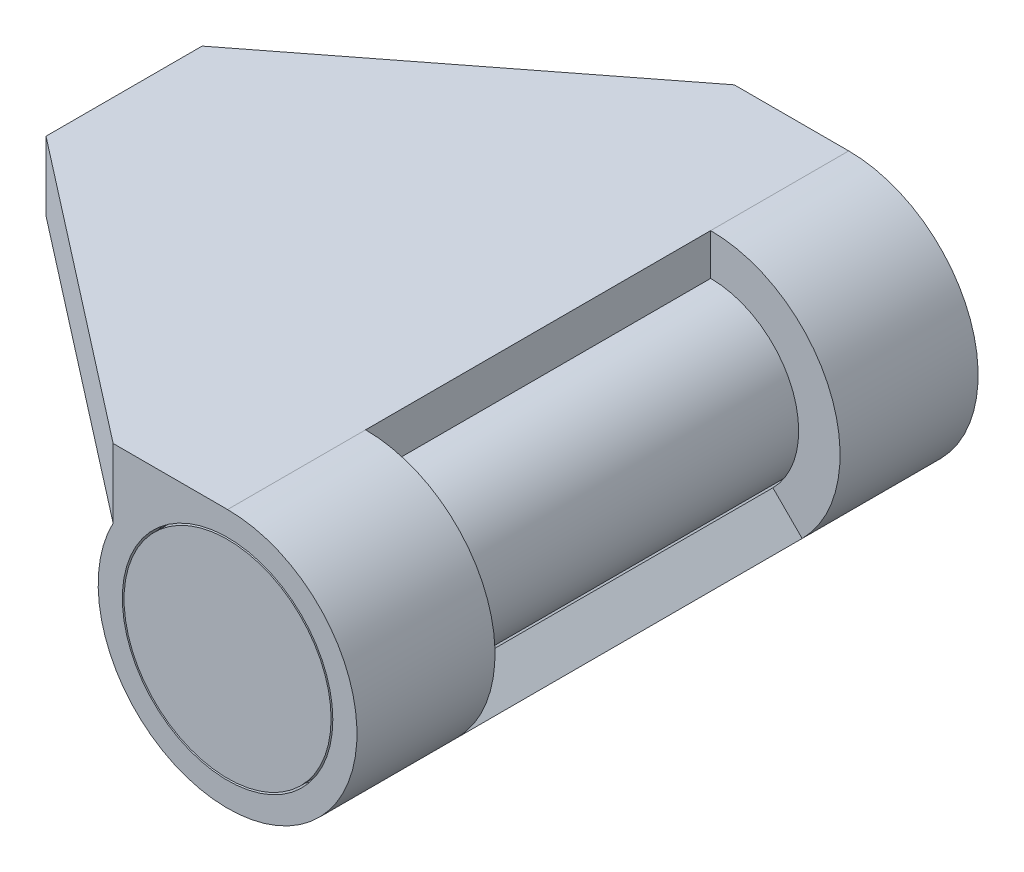
ISO-10303-21;
HEADER;
FILE_DESCRIPTION(('STEP AP214'),'2;1');
FILE_NAME('part.step','',(''),(''),'','','');
FILE_SCHEMA(('AUTOMOTIVE_DESIGN { 1 0 10303 214 1 1 1 1 }'));
ENDSEC;
DATA;
#1=APPLICATION_CONTEXT('core data for automotive mechanical design processes');
#2=APPLICATION_PROTOCOL_DEFINITION('international standard','automotive_design',2000,#1);
#3=PRODUCT_CONTEXT('',#1,'mechanical');
#4=PRODUCT('Part','Part','',(#3));
#5=PRODUCT_RELATED_PRODUCT_CATEGORY('part','',(#4));
#6=PRODUCT_DEFINITION_FORMATION('','',#4);
#7=PRODUCT_DEFINITION_CONTEXT('part definition',#1,'design');
#8=PRODUCT_DEFINITION('design','',#6,#7);
#9=PRODUCT_DEFINITION_SHAPE('','',#8);
#10=(LENGTH_UNIT() NAMED_UNIT(*) SI_UNIT(.MILLI.,.METRE.));
#11=(NAMED_UNIT(*) PLANE_ANGLE_UNIT() SI_UNIT($,.RADIAN.));
#12=(NAMED_UNIT(*) SI_UNIT($,.STERADIAN.) SOLID_ANGLE_UNIT());
#13=UNCERTAINTY_MEASURE_WITH_UNIT(LENGTH_MEASURE(1.E-05),#10,'distance_accuracy_value','');
#14=(GEOMETRIC_REPRESENTATION_CONTEXT(3) GLOBAL_UNCERTAINTY_ASSIGNED_CONTEXT((#13)) GLOBAL_UNIT_ASSIGNED_CONTEXT((#10,
#11,#12)) REPRESENTATION_CONTEXT('',''));
#15=CARTESIAN_POINT('',(0.,0.,0.));
#16=DIRECTION('',(0.,0.,1.));
#17=DIRECTION('',(1.,0.,0.));
#18=AXIS2_PLACEMENT_3D('',#15,#16,#17);
#19=CARTESIAN_POINT('',(0.,0.,8.5));
#20=DIRECTION('',(0.,0.,-1.));
#21=DIRECTION('',(-1.,0.,0.));
#22=AXIS2_PLACEMENT_3D('',#19,#20,#21);
#23=CYLINDRICAL_SURFACE('',#22,3.75);
#24=DIRECTION('',(0.,0.,-1.));
#25=VECTOR('',#24,1.);
#26=CARTESIAN_POINT('',(0.,3.75,9.));
#27=LINE('',#26,#25);
#28=CARTESIAN_POINT('',(0.,3.75,9.));
#29=VERTEX_POINT('',#28);
#30=CARTESIAN_POINT('',(0.,3.75,5.));
#31=VERTEX_POINT('',#30);
#32=EDGE_CURVE('E79',#29,#31,#27,.T.);
#33=ORIENTED_EDGE('',*,*,#32,.F.);
#34=CARTESIAN_POINT('',(0.,0.,9.));
#35=DIRECTION('',(0.,0.,1.));
#36=DIRECTION('',(1.,0.,0.));
#37=AXIS2_PLACEMENT_3D('',#34,#35,#36);
#38=CIRCLE('',#37,3.75);
#39=CARTESIAN_POINT('',(-3.3166247903554,1.75,9.));
#40=VERTEX_POINT('',#39);
#41=EDGE_CURVE('E239',#40,#29,#38,.T.);
#42=ORIENTED_EDGE('',*,*,#41,.F.);
#43=DIRECTION('',(0.,0.,-1.));
#44=VECTOR('',#43,1.);
#45=CARTESIAN_POINT('',(-3.3166247903554,1.75,8.5));
#46=LINE('',#45,#44);
#47=CARTESIAN_POINT('',(-3.3166247903554,1.75,-9.));
#48=VERTEX_POINT('',#47);
#49=EDGE_CURVE('E147',#48,#40,#46,.F.);
#50=ORIENTED_EDGE('',*,*,#49,.F.);
#51=CARTESIAN_POINT('',(0.,0.,-9.));
#52=DIRECTION('',(0.,0.,1.));
#53=DIRECTION('',(1.,0.,0.));
#54=AXIS2_PLACEMENT_3D('',#51,#52,#53);
#55=CIRCLE('',#54,3.75);
#56=CARTESIAN_POINT('',(0.,3.75,-9.));
#57=VERTEX_POINT('',#56);
#58=EDGE_CURVE('E134',#48,#57,#55,.T.);
#59=ORIENTED_EDGE('',*,*,#58,.T.);
#60=DIRECTION('',(0.,0.,1.));
#61=VECTOR('',#60,1.);
#62=CARTESIAN_POINT('',(0.,3.75,-9.));
#63=LINE('',#62,#61);
#64=CARTESIAN_POINT('',(0.,3.75,-5.));
#65=VERTEX_POINT('',#64);
#66=EDGE_CURVE('E145',#57,#65,#63,.T.);
#67=ORIENTED_EDGE('',*,*,#66,.T.);
#68=CARTESIAN_POINT('',(0.,0.,-5.));
#69=DIRECTION('',(0.,0.,1.));
#70=DIRECTION('',(1.,0.,0.));
#71=AXIS2_PLACEMENT_3D('',#68,#69,#70);
#72=CIRCLE('',#71,3.75);
#73=CARTESIAN_POINT('',(2.65165042944955,-2.65165042944956,-5.));
#74=VERTEX_POINT('',#73);
#75=EDGE_CURVE('E150',#74,#65,#72,.T.);
#76=ORIENTED_EDGE('',*,*,#75,.F.);
#77=DIRECTION('',(0.,0.,-1.));
#78=VECTOR('',#77,1.);
#79=CARTESIAN_POINT('',(2.65165042944955,-2.65165042944956,5.));
#80=LINE('',#79,#78);
#81=CARTESIAN_POINT('',(2.65165042944955,-2.65165042944956,5.));
#82=VERTEX_POINT('',#81);
#83=EDGE_CURVE('E230',#82,#74,#80,.T.);
#84=ORIENTED_EDGE('',*,*,#83,.F.);
#85=CARTESIAN_POINT('',(0.,0.,5.));
#86=DIRECTION('',(0.,0.,1.));
#87=DIRECTION('',(1.,0.,0.));
#88=AXIS2_PLACEMENT_3D('',#85,#86,#87);
#89=CIRCLE('',#88,3.75);
#90=EDGE_CURVE('E221',#82,#31,#89,.T.);
#91=ORIENTED_EDGE('',*,*,#90,.T.);
#92=EDGE_LOOP('',(#33,#42,#50,#59,#67,#76,#84,#91));
#93=FACE_BOUND('',#92,.T.);
#94=ADVANCED_FACE('F55',(#93),#23,.T.);
#95=CARTESIAN_POINT('',(0.,0.,8.5));
#96=DIRECTION('',(0.,0.,-1.));
#97=DIRECTION('',(-1.,0.,0.));
#98=AXIS2_PLACEMENT_3D('',#95,#96,#97);
#99=CYLINDRICAL_SURFACE('',#98,2.55);
#100=CARTESIAN_POINT('',(0.,0.,8.));
#101=DIRECTION('',(0.,0.,1.));
#102=DIRECTION('',(1.,0.,0.));
#103=AXIS2_PLACEMENT_3D('',#100,#101,#102);
#104=CIRCLE('',#103,2.55);
#105=CARTESIAN_POINT('',(2.55,0.,8.));
#106=VERTEX_POINT('',#105);
#107=EDGE_CURVE('E242',#106,#106,#104,.T.);
#108=ORIENTED_EDGE('',*,*,#107,.T.);
#109=EDGE_LOOP('',(#108));
#110=FACE_BOUND('',#109,.T.);
#111=DIRECTION('',(0.,0.,-1.));
#112=VECTOR('',#111,1.);
#113=CARTESIAN_POINT('',(1.80312229202569,-1.8031222920257,8.5));
#114=LINE('',#113,#112);
#115=CARTESIAN_POINT('',(1.80312229202569,-1.8031222920257,5.));
#116=VERTEX_POINT('',#115);
#117=CARTESIAN_POINT('',(1.80312229202569,-1.8031222920257,-5.));
#118=VERTEX_POINT('',#117);
#119=EDGE_CURVE('E254',#116,#118,#114,.T.);
#120=ORIENTED_EDGE('',*,*,#119,.T.);
#121=CARTESIAN_POINT('',(0.,0.,-5.));
#122=DIRECTION('',(0.,0.,1.));
#123=DIRECTION('',(1.,0.,0.));
#124=AXIS2_PLACEMENT_3D('',#121,#122,#123);
#125=CIRCLE('',#124,2.55);
#126=CARTESIAN_POINT('',(0.,2.55,-5.));
#127=VERTEX_POINT('',#126);
#128=EDGE_CURVE('E167',#118,#127,#125,.T.);
#129=ORIENTED_EDGE('',*,*,#128,.T.);
#130=DIRECTION('',(0.,0.,-1.));
#131=VECTOR('',#130,1.);
#132=CARTESIAN_POINT('',(0.,2.55,8.5));
#133=LINE('',#132,#131);
#134=CARTESIAN_POINT('',(0.,2.55,5.));
#135=VERTEX_POINT('',#134);
#136=EDGE_CURVE('E65',#127,#135,#133,.F.);
#137=ORIENTED_EDGE('',*,*,#136,.T.);
#138=CARTESIAN_POINT('',(0.,0.,5.));
#139=DIRECTION('',(0.,0.,1.));
#140=DIRECTION('',(1.,0.,0.));
#141=AXIS2_PLACEMENT_3D('',#138,#139,#140);
#142=CIRCLE('',#141,2.55);
#143=EDGE_CURVE('E250',#116,#135,#142,.T.);
#144=ORIENTED_EDGE('',*,*,#143,.F.);
#145=EDGE_LOOP('',(#120,#129,#137,#144));
#146=FACE_BOUND('',#145,.T.);
#147=CARTESIAN_POINT('',(0.,0.,-8.));
#148=DIRECTION('',(0.,0.,1.));
#149=DIRECTION('',(1.,0.,0.));
#150=AXIS2_PLACEMENT_3D('',#147,#148,#149);
#151=CIRCLE('',#150,2.55);
#152=CARTESIAN_POINT('',(2.55,0.,-8.));
#153=VERTEX_POINT('',#152);
#154=EDGE_CURVE('E163',#153,#153,#151,.T.);
#155=ORIENTED_EDGE('',*,*,#154,.F.);
#156=EDGE_LOOP('',(#155));
#157=FACE_BOUND('',#156,.T.);
#158=ADVANCED_FACE('F260',(#110,#146,#157),#99,.F.);
#159=CARTESIAN_POINT('',(0.,0.,8.));
#160=DIRECTION('',(0.,0.,1.));
#161=DIRECTION('',(1.,0.,0.));
#162=AXIS2_PLACEMENT_3D('',#159,#160,#161);
#163=CONICAL_SURFACE('',#162,2.55,0.78539816339745);
#164=CARTESIAN_POINT('',(0.,0.,8.5));
#165=DIRECTION('',(0.,0.,1.));
#166=DIRECTION('',(1.,0.,0.));
#167=AXIS2_PLACEMENT_3D('',#164,#165,#166);
#168=CIRCLE('',#167,3.05);
#169=CARTESIAN_POINT('',(3.05,0.,8.5));
#170=VERTEX_POINT('',#169);
#171=EDGE_CURVE('E246',#170,#170,#168,.F.);
#172=ORIENTED_EDGE('',*,*,#171,.F.);
#173=EDGE_LOOP('',(#172));
#174=FACE_BOUND('',#173,.T.);
#175=ORIENTED_EDGE('',*,*,#107,.F.);
#176=EDGE_LOOP('',(#175));
#177=FACE_BOUND('',#176,.T.);
#178=ADVANCED_FACE('F58',(#174,#177),#163,.F.);
#179=CARTESIAN_POINT('',(0.,0.,9.));
#180=DIRECTION('',(0.,0.,1.));
#181=DIRECTION('',(1.,0.,0.));
#182=AXIS2_PLACEMENT_3D('',#179,#180,#181);
#183=PLANE('',#182);
#184=DIRECTION('',(0.,-1.,0.));
#185=VECTOR('',#184,1.);
#186=CARTESIAN_POINT('',(-3.3166247903554,10.75,9.));
#187=LINE('',#186,#185);
#188=CARTESIAN_POINT('',(-3.3166247903554,3.75,9.));
#189=VERTEX_POINT('',#188);
#190=EDGE_CURVE('E201',#189,#40,#187,.T.);
#191=ORIENTED_EDGE('',*,*,#190,.T.);
#192=ORIENTED_EDGE('',*,*,#41,.T.);
#193=DIRECTION('',(-1.,0.,0.));
#194=VECTOR('',#193,1.);
#195=CARTESIAN_POINT('',(0.,3.75,9.));
#196=LINE('',#195,#194);
#197=EDGE_CURVE('E207',#29,#189,#196,.T.);
#198=ORIENTED_EDGE('',*,*,#197,.T.);
#199=EDGE_LOOP('',(#191,#192,#198));
#200=FACE_BOUND('',#199,.T.);
#201=CARTESIAN_POINT('',(0.,0.,9.));
#202=DIRECTION('',(0.,0.,1.));
#203=DIRECTION('',(1.,0.,0.));
#204=AXIS2_PLACEMENT_3D('',#201,#202,#203);
#205=CIRCLE('',#204,3.05);
#206=CARTESIAN_POINT('',(3.05,0.,9.));
#207=VERTEX_POINT('',#206);
#208=EDGE_CURVE('E235',#207,#207,#205,.T.);
#209=ORIENTED_EDGE('',*,*,#208,.F.);
#210=EDGE_LOOP('',(#209));
#211=FACE_BOUND('',#210,.T.);
#212=ADVANCED_FACE('F295',(#200,#211),#183,.T.);
#213=CARTESIAN_POINT('',(0.,0.,9.));
#214=DIRECTION('',(0.,0.,-1.));
#215=DIRECTION('',(-1.,0.,0.));
#216=AXIS2_PLACEMENT_3D('',#213,#214,#215);
#217=CYLINDRICAL_SURFACE('',#216,3.05);
#218=ORIENTED_EDGE('',*,*,#208,.T.);
#219=EDGE_LOOP('',(#218));
#220=FACE_BOUND('',#219,.T.);
#221=ORIENTED_EDGE('',*,*,#171,.T.);
#222=EDGE_LOOP('',(#221));
#223=FACE_BOUND('',#222,.T.);
#224=ADVANCED_FACE('F297',(#220,#223),#217,.F.);
#225=CARTESIAN_POINT('',(0.,2.51516471011672,5.));
#226=DIRECTION('',(1.,0.,0.));
#227=DIRECTION('',(0.,0.,-1.));
#228=AXIS2_PLACEMENT_3D('',#225,#226,#227);
#229=PLANE('',#228);
#230=ORIENTED_EDGE('',*,*,#136,.F.);
#231=DIRECTION('',(0.,-1.,0.));
#232=VECTOR('',#231,1.);
#233=CARTESIAN_POINT('',(0.,2.51516471011672,-5.));
#234=LINE('',#233,#232);
#235=EDGE_CURVE('E180',#65,#127,#234,.T.);
#236=ORIENTED_EDGE('',*,*,#235,.F.);
#237=DIRECTION('',(0.,0.,-1.));
#238=VECTOR('',#237,1.);
#239=CARTESIAN_POINT('',(0.,3.75,5.));
#240=LINE('',#239,#238);
#241=EDGE_CURVE('E155',#31,#65,#240,.T.);
#242=ORIENTED_EDGE('',*,*,#241,.F.);
#243=DIRECTION('',(0.,-1.,0.));
#244=VECTOR('',#243,1.);
#245=CARTESIAN_POINT('',(0.,2.51516471011672,5.));
#246=LINE('',#245,#244);
#247=EDGE_CURVE('E224',#31,#135,#246,.T.);
#248=ORIENTED_EDGE('',*,*,#247,.T.);
#249=EDGE_LOOP('',(#230,#236,#242,#248));
#250=FACE_BOUND('',#249,.T.);
#251=ADVANCED_FACE('F264',(#250),#229,.T.);
#252=CARTESIAN_POINT('',(1.77849002232462,-1.77849002232463,5.));
#253=DIRECTION('',(0.707106781186549,0.707106781186546,0.));
#254=DIRECTION('',(-0.707106781186546,0.707106781186549,0.));
#255=AXIS2_PLACEMENT_3D('',#252,#253,#254);
#256=PLANE('',#255);
#257=DIRECTION('',(0.707106781186546,-0.707106781186549,0.));
#258=VECTOR('',#257,1.);
#259=CARTESIAN_POINT('',(1.77849002232462,-1.77849002232463,5.));
#260=LINE('',#259,#258);
#261=EDGE_CURVE('E227',#116,#82,#260,.T.);
#262=ORIENTED_EDGE('',*,*,#261,.T.);
#263=ORIENTED_EDGE('',*,*,#83,.T.);
#264=DIRECTION('',(0.707106781186546,-0.707106781186549,0.));
#265=VECTOR('',#264,1.);
#266=CARTESIAN_POINT('',(1.77849002232462,-1.77849002232463,-5.));
#267=LINE('',#266,#265);
#268=EDGE_CURVE('E184',#118,#74,#267,.T.);
#269=ORIENTED_EDGE('',*,*,#268,.F.);
#270=ORIENTED_EDGE('',*,*,#119,.F.);
#271=EDGE_LOOP('',(#262,#263,#269,#270));
#272=FACE_BOUND('',#271,.T.);
#273=ADVANCED_FACE('F271',(#272),#256,.T.);
#274=CARTESIAN_POINT('',(0.,0.,5.));
#275=DIRECTION('',(0.,0.,1.));
#276=DIRECTION('',(1.,0.,0.));
#277=AXIS2_PLACEMENT_3D('',#274,#275,#276);
#278=PLANE('',#277);
#279=ORIENTED_EDGE('',*,*,#143,.T.);
#280=ORIENTED_EDGE('',*,*,#247,.F.);
#281=ORIENTED_EDGE('',*,*,#90,.F.);
#282=ORIENTED_EDGE('',*,*,#261,.F.);
#283=EDGE_LOOP('',(#279,#280,#281,#282));
#284=FACE_BOUND('',#283,.T.);
#285=ADVANCED_FACE('F274',(#284),#278,.F.);
#286=CARTESIAN_POINT('',(-12.,1.75,9.));
#287=DIRECTION('',(0.,1.,0.));
#288=DIRECTION('',(-1.,0.,0.));
#289=AXIS2_PLACEMENT_3D('',#286,#287,#288);
#290=PLANE('',#289);
#291=ORIENTED_EDGE('',*,*,#49,.T.);
#292=DIRECTION('',(0.790040703339742,0.,0.61305439160522));
#293=VECTOR('',#292,1.);
#294=CARTESIAN_POINT('',(-3.3166247903554,1.75,9.));
#295=LINE('',#294,#293);
#296=CARTESIAN_POINT('',(-12.,1.75,2.26188981944225));
#297=VERTEX_POINT('',#296);
#298=EDGE_CURVE('E198',#297,#40,#295,.T.);
#299=ORIENTED_EDGE('',*,*,#298,.F.);
#300=DIRECTION('',(0.,0.,-1.));
#301=VECTOR('',#300,1.);
#302=CARTESIAN_POINT('',(-12.,1.75,9.));
#303=LINE('',#302,#301);
#304=CARTESIAN_POINT('',(-12.,1.75,-2.26188981944225));
#305=VERTEX_POINT('',#304);
#306=EDGE_CURVE('E211',#297,#305,#303,.T.);
#307=ORIENTED_EDGE('',*,*,#306,.T.);
#308=DIRECTION('',(0.790040703339742,0.,-0.61305439160522));
#309=VECTOR('',#308,1.);
#310=CARTESIAN_POINT('',(-3.3166247903554,1.75,-9.));
#311=LINE('',#310,#309);
#312=EDGE_CURVE('E188',#305,#48,#311,.T.);
#313=ORIENTED_EDGE('',*,*,#312,.T.);
#314=EDGE_LOOP('',(#291,#299,#307,#313));
#315=FACE_BOUND('',#314,.T.);
#316=ADVANCED_FACE('F276',(#315),#290,.F.);
#317=CARTESIAN_POINT('',(0.,3.75,9.));
#318=DIRECTION('',(0.,-1.,0.));
#319=DIRECTION('',(1.,0.,0.));
#320=AXIS2_PLACEMENT_3D('',#317,#318,#319);
#321=PLANE('',#320);
#322=DIRECTION('',(0.,0.,-1.));
#323=VECTOR('',#322,1.);
#324=CARTESIAN_POINT('',(-12.,3.75,9.));
#325=LINE('',#324,#323);
#326=CARTESIAN_POINT('',(-12.,3.75,2.26188981944225));
#327=VERTEX_POINT('',#326);
#328=CARTESIAN_POINT('',(-12.,3.75,-2.26188981944225));
#329=VERTEX_POINT('',#328);
#330=EDGE_CURVE('E214',#327,#329,#325,.T.);
#331=ORIENTED_EDGE('',*,*,#330,.F.);
#332=DIRECTION('',(0.790040703339742,0.,0.61305439160522));
#333=VECTOR('',#332,1.);
#334=CARTESIAN_POINT('',(-1.24650595682483,3.75,10.6063671614333));
#335=LINE('',#334,#333);
#336=EDGE_CURVE('E72',#327,#189,#335,.T.);
#337=ORIENTED_EDGE('',*,*,#336,.T.);
#338=ORIENTED_EDGE('',*,*,#197,.F.);
#339=ORIENTED_EDGE('',*,*,#32,.T.);
#340=ORIENTED_EDGE('',*,*,#241,.T.);
#341=ORIENTED_EDGE('',*,*,#66,.F.);
#342=DIRECTION('',(-1.,0.,0.));
#343=VECTOR('',#342,1.);
#344=CARTESIAN_POINT('',(0.,3.75,-9.));
#345=LINE('',#344,#343);
#346=CARTESIAN_POINT('',(-3.3166247903554,3.75,-9.));
#347=VERTEX_POINT('',#346);
#348=EDGE_CURVE('E130',#57,#347,#345,.T.);
#349=ORIENTED_EDGE('',*,*,#348,.T.);
#350=DIRECTION('',(0.790040703339742,0.,-0.61305439160522));
#351=VECTOR('',#350,1.);
#352=CARTESIAN_POINT('',(-1.24650595682483,3.75,-10.6063671614333));
#353=LINE('',#352,#351);
#354=EDGE_CURVE('E191',#329,#347,#353,.T.);
#355=ORIENTED_EDGE('',*,*,#354,.F.);
#356=EDGE_LOOP('',(#331,#337,#338,#339,#340,#341,#349,#355));
#357=FACE_BOUND('',#356,.T.);
#358=ADVANCED_FACE('F153',(#357),#321,.F.);
#359=CARTESIAN_POINT('',(-12.,3.75,9.));
#360=DIRECTION('',(1.,0.,0.));
#361=DIRECTION('',(0.,1.,0.));
#362=AXIS2_PLACEMENT_3D('',#359,#360,#361);
#363=PLANE('',#362);
#364=ORIENTED_EDGE('',*,*,#306,.F.);
#365=DIRECTION('',(0.,1.,0.));
#366=VECTOR('',#365,1.);
#367=CARTESIAN_POINT('',(-12.,3.75,2.26188981944225));
#368=LINE('',#367,#366);
#369=EDGE_CURVE('E12',#297,#327,#368,.T.);
#370=ORIENTED_EDGE('',*,*,#369,.T.);
#371=ORIENTED_EDGE('',*,*,#330,.T.);
#372=DIRECTION('',(0.,1.,0.));
#373=VECTOR('',#372,1.);
#374=CARTESIAN_POINT('',(-12.,3.75,-2.26188981944225));
#375=LINE('',#374,#373);
#376=EDGE_CURVE('E194',#305,#329,#375,.T.);
#377=ORIENTED_EDGE('',*,*,#376,.F.);
#378=EDGE_LOOP('',(#364,#370,#371,#377));
#379=FACE_BOUND('',#378,.T.);
#380=ADVANCED_FACE('F325',(#379),#363,.F.);
#381=CARTESIAN_POINT('',(-3.3166247903554,10.75,9.));
#382=DIRECTION('',(0.61305439160522,0.,-0.790040703339742));
#383=DIRECTION('',(-0.790040703339742,0.,-0.61305439160522));
#384=AXIS2_PLACEMENT_3D('',#381,#382,#383);
#385=PLANE('',#384);
#386=ORIENTED_EDGE('',*,*,#369,.F.);
#387=ORIENTED_EDGE('',*,*,#298,.T.);
#388=ORIENTED_EDGE('',*,*,#190,.F.);
#389=ORIENTED_EDGE('',*,*,#336,.F.);
#390=EDGE_LOOP('',(#386,#387,#388,#389));
#391=FACE_BOUND('',#390,.T.);
#392=ADVANCED_FACE('F333',(#391),#385,.F.);
#393=CARTESIAN_POINT('',(0.,0.,-8.));
#394=DIRECTION('',(0.,0.,-1.));
#395=DIRECTION('',(1.,0.,0.));
#396=AXIS2_PLACEMENT_3D('',#393,#394,#395);
#397=CONICAL_SURFACE('',#396,2.55,0.78539816339745);
#398=CARTESIAN_POINT('',(0.,0.,-8.5));
#399=DIRECTION('',(0.,0.,1.));
#400=DIRECTION('',(1.,0.,0.));
#401=AXIS2_PLACEMENT_3D('',#398,#399,#400);
#402=CIRCLE('',#401,3.05);
#403=CARTESIAN_POINT('',(3.05,0.,-8.5));
#404=VERTEX_POINT('',#403);
#405=EDGE_CURVE('E171',#404,#404,#402,.F.);
#406=ORIENTED_EDGE('',*,*,#405,.T.);
#407=EDGE_LOOP('',(#406));
#408=FACE_BOUND('',#407,.T.);
#409=ORIENTED_EDGE('',*,*,#154,.T.);
#410=EDGE_LOOP('',(#409));
#411=FACE_BOUND('',#410,.T.);
#412=ADVANCED_FACE('F340',(#408,#411),#397,.F.);
#413=CARTESIAN_POINT('',(0.,0.,-9.));
#414=DIRECTION('',(0.,0.,-1.));
#415=DIRECTION('',(1.,0.,0.));
#416=AXIS2_PLACEMENT_3D('',#413,#414,#415);
#417=PLANE('',#416);
#418=DIRECTION('',(0.,-1.,0.));
#419=VECTOR('',#418,1.);
#420=CARTESIAN_POINT('',(-3.3166247903554,10.75,-9.));
#421=LINE('',#420,#419);
#422=EDGE_CURVE('E136',#347,#48,#421,.T.);
#423=ORIENTED_EDGE('',*,*,#422,.F.);
#424=ORIENTED_EDGE('',*,*,#348,.F.);
#425=ORIENTED_EDGE('',*,*,#58,.F.);
#426=EDGE_LOOP('',(#423,#424,#425));
#427=FACE_BOUND('',#426,.T.);
#428=CARTESIAN_POINT('',(0.,0.,-9.));
#429=DIRECTION('',(0.,0.,1.));
#430=DIRECTION('',(1.,0.,0.));
#431=AXIS2_PLACEMENT_3D('',#428,#429,#430);
#432=CIRCLE('',#431,3.05);
#433=CARTESIAN_POINT('',(3.05,0.,-9.));
#434=VERTEX_POINT('',#433);
#435=EDGE_CURVE('E141',#434,#434,#432,.T.);
#436=ORIENTED_EDGE('',*,*,#435,.T.);
#437=EDGE_LOOP('',(#436));
#438=FACE_BOUND('',#437,.T.);
#439=ADVANCED_FACE('F132',(#427,#438),#417,.T.);
#440=CARTESIAN_POINT('',(0.,0.,-9.));
#441=DIRECTION('',(0.,0.,1.));
#442=DIRECTION('',(-1.,0.,0.));
#443=AXIS2_PLACEMENT_3D('',#440,#441,#442);
#444=CYLINDRICAL_SURFACE('',#443,3.05);
#445=ORIENTED_EDGE('',*,*,#435,.F.);
#446=EDGE_LOOP('',(#445));
#447=FACE_BOUND('',#446,.T.);
#448=ORIENTED_EDGE('',*,*,#405,.F.);
#449=EDGE_LOOP('',(#448));
#450=FACE_BOUND('',#449,.T.);
#451=ADVANCED_FACE('F353',(#447,#450),#444,.F.);
#452=CARTESIAN_POINT('',(0.,0.,-5.));
#453=DIRECTION('',(0.,0.,-1.));
#454=DIRECTION('',(1.,0.,0.));
#455=AXIS2_PLACEMENT_3D('',#452,#453,#454);
#456=PLANE('',#455);
#457=ORIENTED_EDGE('',*,*,#128,.F.);
#458=ORIENTED_EDGE('',*,*,#268,.T.);
#459=ORIENTED_EDGE('',*,*,#75,.T.);
#460=ORIENTED_EDGE('',*,*,#235,.T.);
#461=EDGE_LOOP('',(#457,#458,#459,#460));
#462=FACE_BOUND('',#461,.T.);
#463=ADVANCED_FACE('F266',(#462),#456,.F.);
#464=CARTESIAN_POINT('',(-3.3166247903554,10.75,-9.));
#465=DIRECTION('',(0.61305439160522,0.,0.790040703339742));
#466=DIRECTION('',(-0.790040703339742,0.,0.61305439160522));
#467=AXIS2_PLACEMENT_3D('',#464,#465,#466);
#468=PLANE('',#467);
#469=ORIENTED_EDGE('',*,*,#376,.T.);
#470=ORIENTED_EDGE('',*,*,#354,.T.);
#471=ORIENTED_EDGE('',*,*,#422,.T.);
#472=ORIENTED_EDGE('',*,*,#312,.F.);
#473=EDGE_LOOP('',(#469,#470,#471,#472));
#474=FACE_BOUND('',#473,.T.);
#475=ADVANCED_FACE('F368',(#474),#468,.F.);
#476=CLOSED_SHELL('',(#94,#158,#178,#212,#224,#251,#273,#285,#316,#358,#380,#392,#412,#439,#451,
#463,#475));
#477=MANIFOLD_SOLID_BREP('B2',#476);
#478=CARTESIAN_POINT('',(0.,0.,8.));
#479=DIRECTION('',(0.,0.,-1.));
#480=DIRECTION('',(-1.,0.,0.));
#481=AXIS2_PLACEMENT_3D('',#478,#479,#480);
#482=CYLINDRICAL_SURFACE('',#481,2.5);
#483=CARTESIAN_POINT('',(0.,0.,8.));
#484=DIRECTION('',(0.,0.,1.));
#485=DIRECTION('',(1.,0.,0.));
#486=AXIS2_PLACEMENT_3D('',#483,#484,#485);
#487=CIRCLE('',#486,2.5);
#488=CARTESIAN_POINT('',(2.5,0.,8.));
#489=VERTEX_POINT('',#488);
#490=EDGE_CURVE('E464',#489,#489,#487,.T.);
#491=ORIENTED_EDGE('',*,*,#490,.F.);
#492=EDGE_LOOP('',(#491));
#493=FACE_BOUND('',#492,.T.);
#494=CARTESIAN_POINT('',(0.,0.,-8.));
#495=DIRECTION('',(0.,0.,1.));
#496=DIRECTION('',(1.,0.,0.));
#497=AXIS2_PLACEMENT_3D('',#494,#495,#496);
#498=CIRCLE('',#497,2.5);
#499=CARTESIAN_POINT('',(2.5,0.,-8.));
#500=VERTEX_POINT('',#499);
#501=EDGE_CURVE('E480',#500,#500,#498,.T.);
#502=ORIENTED_EDGE('',*,*,#501,.T.);
#503=EDGE_LOOP('',(#502));
#504=FACE_BOUND('',#503,.T.);
#505=ADVANCED_FACE('F456',(#493,#504),#482,.T.);
#506=CARTESIAN_POINT('',(0.,0.,9.));
#507=DIRECTION('',(0.,0.,-1.));
#508=DIRECTION('',(-1.,0.,0.));
#509=AXIS2_PLACEMENT_3D('',#506,#507,#508);
#510=CYLINDRICAL_SURFACE('',#509,3.);
#511=CARTESIAN_POINT('',(0.,0.,8.5));
#512=DIRECTION('',(0.,0.,1.));
#513=DIRECTION('',(1.,0.,0.));
#514=AXIS2_PLACEMENT_3D('',#511,#512,#513);
#515=CIRCLE('',#514,3.);
#516=CARTESIAN_POINT('',(3.,0.,8.5));
#517=VERTEX_POINT('',#516);
#518=EDGE_CURVE('E54',#517,#517,#515,.T.);
#519=ORIENTED_EDGE('',*,*,#518,.T.);
#520=EDGE_LOOP('',(#519));
#521=FACE_BOUND('',#520,.T.);
#522=CARTESIAN_POINT('',(0.,0.,9.));
#523=DIRECTION('',(0.,0.,1.));
#524=DIRECTION('',(1.,0.,0.));
#525=AXIS2_PLACEMENT_3D('',#522,#523,#524);
#526=CIRCLE('',#525,3.);
#527=CARTESIAN_POINT('',(3.,0.,9.));
#528=VERTEX_POINT('',#527);
#529=EDGE_CURVE('E468',#528,#528,#526,.T.);
#530=ORIENTED_EDGE('',*,*,#529,.F.);
#531=EDGE_LOOP('',(#530));
#532=FACE_BOUND('',#531,.T.);
#533=ADVANCED_FACE('F503',(#521,#532),#510,.T.);
#534=CARTESIAN_POINT('',(0.,0.,9.));
#535=DIRECTION('',(0.,0.,1.));
#536=DIRECTION('',(1.,0.,0.));
#537=AXIS2_PLACEMENT_3D('',#534,#535,#536);
#538=PLANE('',#537);
#539=ORIENTED_EDGE('',*,*,#529,.T.);
#540=EDGE_LOOP('',(#539));
#541=FACE_BOUND('',#540,.T.);
#542=ADVANCED_FACE('F509',(#541),#538,.T.);
#543=CARTESIAN_POINT('',(0.,0.,8.5));
#544=DIRECTION('',(0.,0.,1.));
#545=DIRECTION('',(1.,0.,0.));
#546=AXIS2_PLACEMENT_3D('',#543,#544,#545);
#547=CONICAL_SURFACE('',#546,3.,0.785398163397451);
#548=ORIENTED_EDGE('',*,*,#490,.T.);
#549=EDGE_LOOP('',(#548));
#550=FACE_BOUND('',#549,.T.);
#551=ORIENTED_EDGE('',*,*,#518,.F.);
#552=EDGE_LOOP('',(#551));
#553=FACE_BOUND('',#552,.T.);
#554=ADVANCED_FACE('F459',(#550,#553),#547,.T.);
#555=CARTESIAN_POINT('',(0.,0.,-9.));
#556=DIRECTION('',(0.,0.,1.));
#557=DIRECTION('',(-1.,0.,0.));
#558=AXIS2_PLACEMENT_3D('',#555,#556,#557);
#559=CYLINDRICAL_SURFACE('',#558,3.);
#560=CARTESIAN_POINT('',(0.,0.,-8.5));
#561=DIRECTION('',(0.,0.,1.));
#562=DIRECTION('',(1.,0.,0.));
#563=AXIS2_PLACEMENT_3D('',#560,#561,#562);
#564=CIRCLE('',#563,3.);
#565=CARTESIAN_POINT('',(3.,0.,-8.5));
#566=VERTEX_POINT('',#565);
#567=EDGE_CURVE('E477',#566,#566,#564,.T.);
#568=ORIENTED_EDGE('',*,*,#567,.F.);
#569=EDGE_LOOP('',(#568));
#570=FACE_BOUND('',#569,.T.);
#571=CARTESIAN_POINT('',(0.,0.,-9.));
#572=DIRECTION('',(0.,0.,1.));
#573=DIRECTION('',(1.,0.,0.));
#574=AXIS2_PLACEMENT_3D('',#571,#572,#573);
#575=CIRCLE('',#574,3.);
#576=CARTESIAN_POINT('',(3.,0.,-9.));
#577=VERTEX_POINT('',#576);
#578=EDGE_CURVE('E472',#577,#577,#575,.T.);
#579=ORIENTED_EDGE('',*,*,#578,.T.);
#580=EDGE_LOOP('',(#579));
#581=FACE_BOUND('',#580,.T.);
#582=ADVANCED_FACE('F492',(#570,#581),#559,.T.);
#583=CARTESIAN_POINT('',(0.,0.,-9.));
#584=DIRECTION('',(0.,0.,-1.));
#585=DIRECTION('',(1.,0.,0.));
#586=AXIS2_PLACEMENT_3D('',#583,#584,#585);
#587=PLANE('',#586);
#588=ORIENTED_EDGE('',*,*,#578,.F.);
#589=EDGE_LOOP('',(#588));
#590=FACE_BOUND('',#589,.T.);
#591=ADVANCED_FACE('F488',(#590),#587,.T.);
#592=CARTESIAN_POINT('',(0.,0.,-8.5));
#593=DIRECTION('',(0.,0.,-1.));
#594=DIRECTION('',(1.,0.,0.));
#595=AXIS2_PLACEMENT_3D('',#592,#593,#594);
#596=CONICAL_SURFACE('',#595,3.,0.785398163397451);
#597=ORIENTED_EDGE('',*,*,#501,.F.);
#598=EDGE_LOOP('',(#597));
#599=FACE_BOUND('',#598,.T.);
#600=ORIENTED_EDGE('',*,*,#567,.T.);
#601=EDGE_LOOP('',(#600));
#602=FACE_BOUND('',#601,.T.);
#603=ADVANCED_FACE('F485',(#599,#602),#596,.T.);
#604=CLOSED_SHELL('',(#505,#533,#542,#554,#582,#591,#603));
#605=MANIFOLD_SOLID_BREP('B6',#604);
#606=ADVANCED_BREP_SHAPE_REPRESENTATION('',(#18,#477,#605),#14);
#607=SHAPE_DEFINITION_REPRESENTATION(#9,#606);
ENDSEC;
END-ISO-10303-21;
